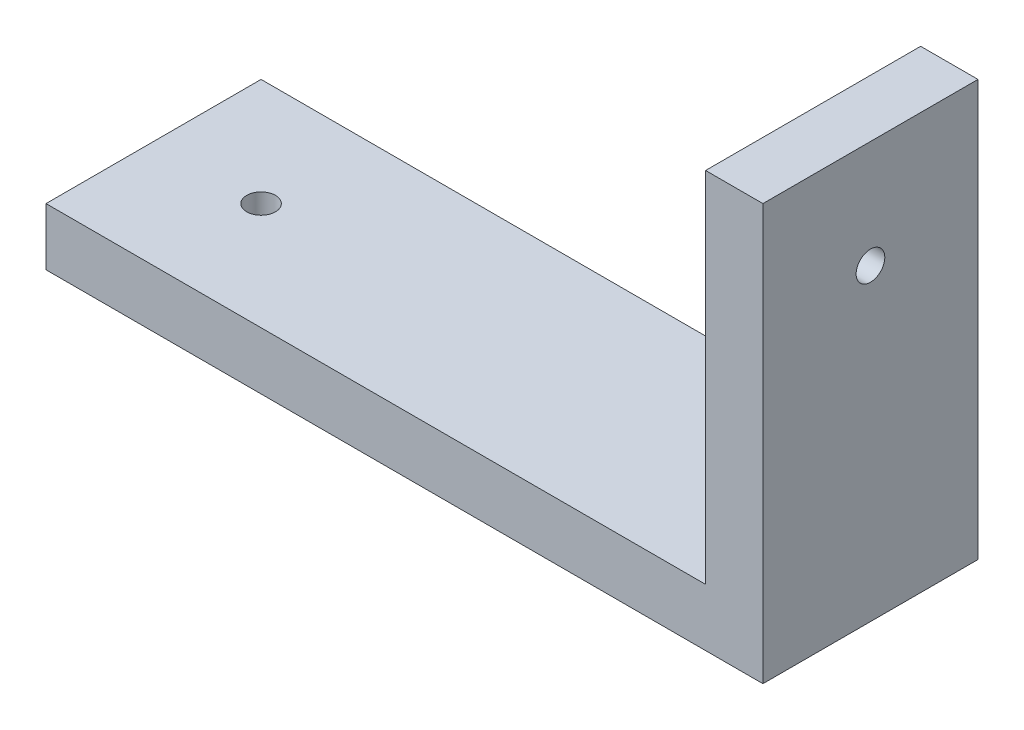
ISO-10303-21;
HEADER;
FILE_DESCRIPTION(('STEP AP214'),'2;1');
FILE_NAME('part.step','',(''),(''),'','','');
FILE_SCHEMA(('AUTOMOTIVE_DESIGN { 1 0 10303 214 1 1 1 1 }'));
ENDSEC;
DATA;
#1=APPLICATION_CONTEXT('core data for automotive mechanical design processes');
#2=APPLICATION_PROTOCOL_DEFINITION('international standard','automotive_design',2000,#1);
#3=PRODUCT_CONTEXT('',#1,'mechanical');
#4=PRODUCT('Part','Part','',(#3));
#5=PRODUCT_RELATED_PRODUCT_CATEGORY('part','',(#4));
#6=PRODUCT_DEFINITION_FORMATION('','',#4);
#7=PRODUCT_DEFINITION_CONTEXT('part definition',#1,'design');
#8=PRODUCT_DEFINITION('design','',#6,#7);
#9=PRODUCT_DEFINITION_SHAPE('','',#8);
#10=(LENGTH_UNIT() NAMED_UNIT(*) SI_UNIT(.MILLI.,.METRE.));
#11=(NAMED_UNIT(*) PLANE_ANGLE_UNIT() SI_UNIT($,.RADIAN.));
#12=(NAMED_UNIT(*) SI_UNIT($,.STERADIAN.) SOLID_ANGLE_UNIT());
#13=UNCERTAINTY_MEASURE_WITH_UNIT(LENGTH_MEASURE(1.E-05),#10,'distance_accuracy_value','');
#14=(GEOMETRIC_REPRESENTATION_CONTEXT(3) GLOBAL_UNCERTAINTY_ASSIGNED_CONTEXT((#13)) GLOBAL_UNIT_ASSIGNED_CONTEXT((#10,
#11,#12)) REPRESENTATION_CONTEXT('',''));
#15=CARTESIAN_POINT('',(0.,0.,0.));
#16=DIRECTION('',(0.,0.,1.));
#17=DIRECTION('',(1.,0.,0.));
#18=AXIS2_PLACEMENT_3D('',#15,#16,#17);
#19=CARTESIAN_POINT('',(0.,8.,0.));
#20=DIRECTION('',(0.,1.,0.));
#21=DIRECTION('',(0.,0.,1.));
#22=AXIS2_PLACEMENT_3D('',#19,#20,#21);
#23=PLANE('',#22);
#24=DIRECTION('',(0.,0.,1.));
#25=VECTOR('',#24,1.);
#26=CARTESIAN_POINT('',(42.,8.,-15.));
#27=LINE('',#26,#25);
#28=CARTESIAN_POINT('',(42.,8.,-15.));
#29=VERTEX_POINT('',#28);
#30=CARTESIAN_POINT('',(42.,8.,15.));
#31=VERTEX_POINT('',#30);
#32=EDGE_CURVE('E49',#29,#31,#27,.T.);
#33=ORIENTED_EDGE('',*,*,#32,.F.);
#34=DIRECTION('',(-1.,0.,0.));
#35=VECTOR('',#34,1.);
#36=CARTESIAN_POINT('',(-50.,8.,-15.));
#37=LINE('',#36,#35);
#38=CARTESIAN_POINT('',(-50.,8.,-15.));
#39=VERTEX_POINT('',#38);
#40=EDGE_CURVE('E86',#29,#39,#37,.T.);
#41=ORIENTED_EDGE('',*,*,#40,.T.);
#42=DIRECTION('',(0.,0.,1.));
#43=VECTOR('',#42,1.);
#44=CARTESIAN_POINT('',(-50.,8.,-15.));
#45=LINE('',#44,#43);
#46=CARTESIAN_POINT('',(-50.,8.,15.));
#47=VERTEX_POINT('',#46);
#48=EDGE_CURVE('E55',#39,#47,#45,.T.);
#49=ORIENTED_EDGE('',*,*,#48,.T.);
#50=DIRECTION('',(1.,0.,0.));
#51=VECTOR('',#50,1.);
#52=CARTESIAN_POINT('',(-50.,8.,15.));
#53=LINE('',#52,#51);
#54=EDGE_CURVE('E96',#47,#31,#53,.T.);
#55=ORIENTED_EDGE('',*,*,#54,.T.);
#56=EDGE_LOOP('',(#33,#41,#49,#55));
#57=FACE_BOUND('',#56,.T.);
#58=CARTESIAN_POINT('',(-35.,8.,0.));
#59=DIRECTION('',(0.,1.,0.));
#60=DIRECTION('',(0.,0.,1.));
#61=AXIS2_PLACEMENT_3D('',#58,#59,#60);
#62=CIRCLE('',#61,2.);
#63=CARTESIAN_POINT('',(-35.,8.,2.));
#64=VERTEX_POINT('',#63);
#65=EDGE_CURVE('E101',#64,#64,#62,.T.);
#66=ORIENTED_EDGE('',*,*,#65,.F.);
#67=EDGE_LOOP('',(#66));
#68=FACE_BOUND('',#67,.T.);
#69=ADVANCED_FACE('F33',(#57,#68),#23,.T.);
#70=CARTESIAN_POINT('',(0.,0.,0.));
#71=DIRECTION('',(0.,1.,0.));
#72=DIRECTION('',(0.,0.,1.));
#73=AXIS2_PLACEMENT_3D('',#70,#71,#72);
#74=PLANE('',#73);
#75=DIRECTION('',(0.,0.,-1.));
#76=VECTOR('',#75,1.);
#77=CARTESIAN_POINT('',(50.,0.,-15.));
#78=LINE('',#77,#76);
#79=CARTESIAN_POINT('',(50.,0.,15.));
#80=VERTEX_POINT('',#79);
#81=CARTESIAN_POINT('',(50.,0.,-15.));
#82=VERTEX_POINT('',#81);
#83=EDGE_CURVE('E93',#80,#82,#78,.T.);
#84=ORIENTED_EDGE('',*,*,#83,.F.);
#85=DIRECTION('',(1.,0.,0.));
#86=VECTOR('',#85,1.);
#87=CARTESIAN_POINT('',(-50.,0.,15.));
#88=LINE('',#87,#86);
#89=CARTESIAN_POINT('',(-50.,0.,15.));
#90=VERTEX_POINT('',#89);
#91=EDGE_CURVE('E75',#90,#80,#88,.T.);
#92=ORIENTED_EDGE('',*,*,#91,.F.);
#93=DIRECTION('',(0.,0.,1.));
#94=VECTOR('',#93,1.);
#95=CARTESIAN_POINT('',(-50.,0.,-15.));
#96=LINE('',#95,#94);
#97=CARTESIAN_POINT('',(-50.,0.,-15.));
#98=VERTEX_POINT('',#97);
#99=EDGE_CURVE('E87',#98,#90,#96,.T.);
#100=ORIENTED_EDGE('',*,*,#99,.F.);
#101=DIRECTION('',(-1.,0.,0.));
#102=VECTOR('',#101,1.);
#103=CARTESIAN_POINT('',(-50.,0.,-15.));
#104=LINE('',#103,#102);
#105=EDGE_CURVE('E100',#82,#98,#104,.T.);
#106=ORIENTED_EDGE('',*,*,#105,.F.);
#107=EDGE_LOOP('',(#84,#92,#100,#106));
#108=FACE_BOUND('',#107,.T.);
#109=CARTESIAN_POINT('',(-35.,0.,0.));
#110=DIRECTION('',(0.,1.,0.));
#111=DIRECTION('',(0.,0.,1.));
#112=AXIS2_PLACEMENT_3D('',#109,#110,#111);
#113=CIRCLE('',#112,2.);
#114=CARTESIAN_POINT('',(-35.,0.,2.));
#115=VERTEX_POINT('',#114);
#116=EDGE_CURVE('E105',#115,#115,#113,.T.);
#117=ORIENTED_EDGE('',*,*,#116,.T.);
#118=EDGE_LOOP('',(#117));
#119=FACE_BOUND('',#118,.T.);
#120=ADVANCED_FACE('F98',(#108,#119),#74,.F.);
#121=CARTESIAN_POINT('',(50.,8.,-15.));
#122=DIRECTION('',(-1.,0.,0.));
#123=DIRECTION('',(0.,0.,1.));
#124=AXIS2_PLACEMENT_3D('',#121,#122,#123);
#125=PLANE('',#124);
#126=CARTESIAN_POINT('',(50.,43.,0.));
#127=DIRECTION('',(1.,0.,0.));
#128=DIRECTION('',(0.,0.,-1.));
#129=AXIS2_PLACEMENT_3D('',#126,#127,#128);
#130=CIRCLE('',#129,2.);
#131=CARTESIAN_POINT('',(50.,43.,-2.));
#132=VERTEX_POINT('',#131);
#133=EDGE_CURVE('E252',#132,#132,#130,.T.);
#134=ORIENTED_EDGE('',*,*,#133,.F.);
#135=EDGE_LOOP('',(#134));
#136=FACE_BOUND('',#135,.T.);
#137=ORIENTED_EDGE('',*,*,#83,.T.);
#138=DIRECTION('',(0.,-1.,0.));
#139=VECTOR('',#138,1.);
#140=CARTESIAN_POINT('',(50.,8.,-15.));
#141=LINE('',#140,#139);
#142=CARTESIAN_POINT('',(50.,58.,-15.));
#143=VERTEX_POINT('',#142);
#144=EDGE_CURVE('E11',#143,#82,#141,.T.);
#145=ORIENTED_EDGE('',*,*,#144,.F.);
#146=DIRECTION('',(0.,0.,-1.));
#147=VECTOR('',#146,1.);
#148=CARTESIAN_POINT('',(50.,58.,-15.));
#149=LINE('',#148,#147);
#150=CARTESIAN_POINT('',(50.,58.,15.));
#151=VERTEX_POINT('',#150);
#152=EDGE_CURVE('E95',#151,#143,#149,.T.);
#153=ORIENTED_EDGE('',*,*,#152,.F.);
#154=DIRECTION('',(0.,-1.,0.));
#155=VECTOR('',#154,1.);
#156=CARTESIAN_POINT('',(50.,8.,15.));
#157=LINE('',#156,#155);
#158=EDGE_CURVE('E79',#151,#80,#157,.T.);
#159=ORIENTED_EDGE('',*,*,#158,.T.);
#160=EDGE_LOOP('',(#137,#145,#153,#159));
#161=FACE_BOUND('',#160,.T.);
#162=ADVANCED_FACE('F35',(#136,#161),#125,.F.);
#163=CARTESIAN_POINT('',(-50.,8.,-15.));
#164=DIRECTION('',(0.,0.,1.));
#165=DIRECTION('',(1.,0.,0.));
#166=AXIS2_PLACEMENT_3D('',#163,#164,#165);
#167=PLANE('',#166);
#168=ORIENTED_EDGE('',*,*,#105,.T.);
#169=DIRECTION('',(0.,-1.,0.));
#170=VECTOR('',#169,1.);
#171=CARTESIAN_POINT('',(-50.,8.,-15.));
#172=LINE('',#171,#170);
#173=EDGE_CURVE('E42',#39,#98,#172,.T.);
#174=ORIENTED_EDGE('',*,*,#173,.F.);
#175=ORIENTED_EDGE('',*,*,#40,.F.);
#176=DIRECTION('',(0.,-1.,0.));
#177=VECTOR('',#176,1.);
#178=CARTESIAN_POINT('',(42.,58.,-15.));
#179=LINE('',#178,#177);
#180=CARTESIAN_POINT('',(42.,58.,-15.));
#181=VERTEX_POINT('',#180);
#182=EDGE_CURVE('E143',#181,#29,#179,.T.);
#183=ORIENTED_EDGE('',*,*,#182,.F.);
#184=DIRECTION('',(-1.,0.,0.));
#185=VECTOR('',#184,1.);
#186=CARTESIAN_POINT('',(50.,58.,-15.));
#187=LINE('',#186,#185);
#188=EDGE_CURVE('E123',#143,#181,#187,.T.);
#189=ORIENTED_EDGE('',*,*,#188,.F.);
#190=ORIENTED_EDGE('',*,*,#144,.T.);
#191=EDGE_LOOP('',(#168,#174,#175,#183,#189,#190));
#192=FACE_BOUND('',#191,.T.);
#193=ADVANCED_FACE('F117',(#192),#167,.F.);
#194=CARTESIAN_POINT('',(-50.,8.,-15.));
#195=DIRECTION('',(1.,0.,0.));
#196=DIRECTION('',(0.,0.,-1.));
#197=AXIS2_PLACEMENT_3D('',#194,#195,#196);
#198=PLANE('',#197);
#199=ORIENTED_EDGE('',*,*,#99,.T.);
#200=DIRECTION('',(0.,-1.,0.));
#201=VECTOR('',#200,1.);
#202=CARTESIAN_POINT('',(-50.,8.,15.));
#203=LINE('',#202,#201);
#204=EDGE_CURVE('E82',#47,#90,#203,.T.);
#205=ORIENTED_EDGE('',*,*,#204,.F.);
#206=ORIENTED_EDGE('',*,*,#48,.F.);
#207=ORIENTED_EDGE('',*,*,#173,.T.);
#208=EDGE_LOOP('',(#199,#205,#206,#207));
#209=FACE_BOUND('',#208,.T.);
#210=ADVANCED_FACE('F115',(#209),#198,.F.);
#211=CARTESIAN_POINT('',(-50.,8.,15.));
#212=DIRECTION('',(0.,0.,-1.));
#213=DIRECTION('',(-1.,0.,0.));
#214=AXIS2_PLACEMENT_3D('',#211,#212,#213);
#215=PLANE('',#214);
#216=ORIENTED_EDGE('',*,*,#91,.T.);
#217=ORIENTED_EDGE('',*,*,#158,.F.);
#218=DIRECTION('',(1.,0.,0.));
#219=VECTOR('',#218,1.);
#220=CARTESIAN_POINT('',(50.,58.,15.));
#221=LINE('',#220,#219);
#222=CARTESIAN_POINT('',(42.,58.,15.));
#223=VERTEX_POINT('',#222);
#224=EDGE_CURVE('E137',#223,#151,#221,.T.);
#225=ORIENTED_EDGE('',*,*,#224,.F.);
#226=DIRECTION('',(0.,-1.,0.));
#227=VECTOR('',#226,1.);
#228=CARTESIAN_POINT('',(42.,58.,15.));
#229=LINE('',#228,#227);
#230=EDGE_CURVE('E141',#223,#31,#229,.T.);
#231=ORIENTED_EDGE('',*,*,#230,.T.);
#232=ORIENTED_EDGE('',*,*,#54,.F.);
#233=ORIENTED_EDGE('',*,*,#204,.T.);
#234=EDGE_LOOP('',(#216,#217,#225,#231,#232,#233));
#235=FACE_BOUND('',#234,.T.);
#236=ADVANCED_FACE('F77',(#235),#215,.F.);
#237=CARTESIAN_POINT('',(-35.,8.,0.));
#238=DIRECTION('',(0.,-1.,0.));
#239=DIRECTION('',(0.,0.,-1.));
#240=AXIS2_PLACEMENT_3D('',#237,#238,#239);
#241=CYLINDRICAL_SURFACE('',#240,2.);
#242=ORIENTED_EDGE('',*,*,#65,.T.);
#243=EDGE_LOOP('',(#242));
#244=FACE_BOUND('',#243,.T.);
#245=ORIENTED_EDGE('',*,*,#116,.F.);
#246=EDGE_LOOP('',(#245));
#247=FACE_BOUND('',#246,.T.);
#248=ADVANCED_FACE('F157',(#244,#247),#241,.F.);
#249=CARTESIAN_POINT('',(42.,58.,-15.));
#250=DIRECTION('',(1.,0.,0.));
#251=DIRECTION('',(0.,0.,-1.));
#252=AXIS2_PLACEMENT_3D('',#249,#250,#251);
#253=PLANE('',#252);
#254=CARTESIAN_POINT('',(42.,43.,0.));
#255=DIRECTION('',(1.,0.,0.));
#256=DIRECTION('',(0.,0.,-1.));
#257=AXIS2_PLACEMENT_3D('',#254,#255,#256);
#258=CIRCLE('',#257,2.);
#259=CARTESIAN_POINT('',(42.,43.,-2.));
#260=VERTEX_POINT('',#259);
#261=EDGE_CURVE('E37',#260,#260,#258,.T.);
#262=ORIENTED_EDGE('',*,*,#261,.T.);
#263=EDGE_LOOP('',(#262));
#264=FACE_BOUND('',#263,.T.);
#265=ORIENTED_EDGE('',*,*,#32,.T.);
#266=ORIENTED_EDGE('',*,*,#230,.F.);
#267=DIRECTION('',(0.,0.,1.));
#268=VECTOR('',#267,1.);
#269=CARTESIAN_POINT('',(42.,58.,-15.));
#270=LINE('',#269,#268);
#271=EDGE_CURVE('E134',#181,#223,#270,.T.);
#272=ORIENTED_EDGE('',*,*,#271,.F.);
#273=ORIENTED_EDGE('',*,*,#182,.T.);
#274=EDGE_LOOP('',(#265,#266,#272,#273));
#275=FACE_BOUND('',#274,.T.);
#276=ADVANCED_FACE('F142',(#264,#275),#253,.F.);
#277=CARTESIAN_POINT('',(0.,58.,0.));
#278=DIRECTION('',(0.,-1.,0.));
#279=DIRECTION('',(0.,0.,-1.));
#280=AXIS2_PLACEMENT_3D('',#277,#278,#279);
#281=PLANE('',#280);
#282=ORIENTED_EDGE('',*,*,#152,.T.);
#283=ORIENTED_EDGE('',*,*,#188,.T.);
#284=ORIENTED_EDGE('',*,*,#271,.T.);
#285=ORIENTED_EDGE('',*,*,#224,.T.);
#286=EDGE_LOOP('',(#282,#283,#284,#285));
#287=FACE_BOUND('',#286,.T.);
#288=ADVANCED_FACE('F136',(#287),#281,.F.);
#289=CARTESIAN_POINT('',(-50.,43.,0.));
#290=DIRECTION('',(1.,0.,0.));
#291=DIRECTION('',(0.,0.,-1.));
#292=AXIS2_PLACEMENT_3D('',#289,#290,#291);
#293=CYLINDRICAL_SURFACE('',#292,2.);
#294=ORIENTED_EDGE('',*,*,#133,.T.);
#295=EDGE_LOOP('',(#294));
#296=FACE_BOUND('',#295,.T.);
#297=ORIENTED_EDGE('',*,*,#261,.F.);
#298=EDGE_LOOP('',(#297));
#299=FACE_BOUND('',#298,.T.);
#300=ADVANCED_FACE('F204',(#296,#299),#293,.F.);
#301=CLOSED_SHELL('',(#69,#120,#162,#193,#210,#236,#248,#276,#288,#300));
#302=MANIFOLD_SOLID_BREP('B2',#301);
#303=ADVANCED_BREP_SHAPE_REPRESENTATION('',(#18,#302),#14);
#304=SHAPE_DEFINITION_REPRESENTATION(#9,#303);
ENDSEC;
END-ISO-10303-21;
